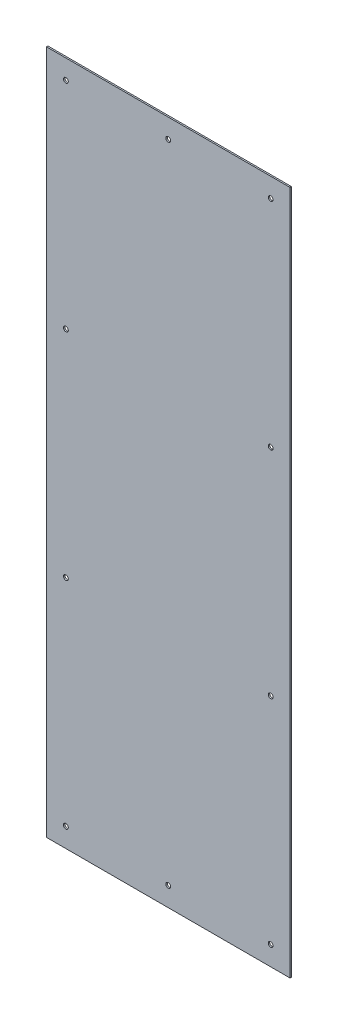
ISO-10303-21;
HEADER;
FILE_DESCRIPTION(('STEP AP214'),'2;1');
FILE_NAME('part.step','',(''),(''),'','','');
FILE_SCHEMA(('AUTOMOTIVE_DESIGN { 1 0 10303 214 1 1 1 1 }'));
ENDSEC;
DATA;
#1=APPLICATION_CONTEXT('core data for automotive mechanical design processes');
#2=APPLICATION_PROTOCOL_DEFINITION('international standard','automotive_design',2000,#1);
#3=PRODUCT_CONTEXT('',#1,'mechanical');
#4=PRODUCT('Part','Part','',(#3));
#5=PRODUCT_RELATED_PRODUCT_CATEGORY('part','',(#4));
#6=PRODUCT_DEFINITION_FORMATION('','',#4);
#7=PRODUCT_DEFINITION_CONTEXT('part definition',#1,'design');
#8=PRODUCT_DEFINITION('design','',#6,#7);
#9=PRODUCT_DEFINITION_SHAPE('','',#8);
#10=(LENGTH_UNIT() NAMED_UNIT(*) SI_UNIT(.MILLI.,.METRE.));
#11=(NAMED_UNIT(*) PLANE_ANGLE_UNIT() SI_UNIT($,.RADIAN.));
#12=(NAMED_UNIT(*) SI_UNIT($,.STERADIAN.) SOLID_ANGLE_UNIT());
#13=UNCERTAINTY_MEASURE_WITH_UNIT(LENGTH_MEASURE(1.E-05),#10,'distance_accuracy_value','');
#14=(GEOMETRIC_REPRESENTATION_CONTEXT(3) GLOBAL_UNCERTAINTY_ASSIGNED_CONTEXT((#13)) GLOBAL_UNIT_ASSIGNED_CONTEXT((#10,
#11,#12)) REPRESENTATION_CONTEXT('',''));
#15=CARTESIAN_POINT('',(0.,0.,0.));
#16=DIRECTION('',(0.,0.,1.));
#17=DIRECTION('',(1.,0.,0.));
#18=AXIS2_PLACEMENT_3D('',#15,#16,#17);
#19=CARTESIAN_POINT('',(160.,450.,1.9));
#20=DIRECTION('',(-1.,0.,0.));
#21=DIRECTION('',(0.,-1.,0.));
#22=AXIS2_PLACEMENT_3D('',#19,#20,#21);
#23=PLANE('',#22);
#24=DIRECTION('',(0.,1.,0.));
#25=VECTOR('',#24,1.);
#26=CARTESIAN_POINT('',(160.,450.,0.));
#27=LINE('',#26,#25);
#28=CARTESIAN_POINT('',(160.,-450.,0.));
#29=VERTEX_POINT('',#28);
#30=CARTESIAN_POINT('',(160.,450.,0.));
#31=VERTEX_POINT('',#30);
#32=EDGE_CURVE('E98',#29,#31,#27,.T.);
#33=ORIENTED_EDGE('',*,*,#32,.T.);
#34=DIRECTION('',(0.,0.,-1.));
#35=VECTOR('',#34,1.);
#36=CARTESIAN_POINT('',(160.,450.,1.9));
#37=LINE('',#36,#35);
#38=CARTESIAN_POINT('',(160.,450.,1.9));
#39=VERTEX_POINT('',#38);
#40=EDGE_CURVE('E11',#39,#31,#37,.T.);
#41=ORIENTED_EDGE('',*,*,#40,.F.);
#42=DIRECTION('',(0.,1.,0.));
#43=VECTOR('',#42,1.);
#44=CARTESIAN_POINT('',(160.,450.,1.9));
#45=LINE('',#44,#43);
#46=CARTESIAN_POINT('',(160.,-450.,1.9));
#47=VERTEX_POINT('',#46);
#48=EDGE_CURVE('E85',#47,#39,#45,.T.);
#49=ORIENTED_EDGE('',*,*,#48,.F.);
#50=DIRECTION('',(0.,0.,-1.));
#51=VECTOR('',#50,1.);
#52=CARTESIAN_POINT('',(160.,-450.,1.9));
#53=LINE('',#52,#51);
#54=EDGE_CURVE('E94',#47,#29,#53,.T.);
#55=ORIENTED_EDGE('',*,*,#54,.T.);
#56=EDGE_LOOP('',(#33,#41,#49,#55));
#57=FACE_BOUND('',#56,.T.);
#58=ADVANCED_FACE('F32',(#57),#23,.F.);
#59=CARTESIAN_POINT('',(-160.,450.,1.9));
#60=DIRECTION('',(0.,-1.,0.));
#61=DIRECTION('',(0.,0.,-1.));
#62=AXIS2_PLACEMENT_3D('',#59,#60,#61);
#63=PLANE('',#62);
#64=DIRECTION('',(-1.,0.,0.));
#65=VECTOR('',#64,1.);
#66=CARTESIAN_POINT('',(-160.,450.,0.));
#67=LINE('',#66,#65);
#68=CARTESIAN_POINT('',(-160.,450.,0.));
#69=VERTEX_POINT('',#68);
#70=EDGE_CURVE('E89',#31,#69,#67,.T.);
#71=ORIENTED_EDGE('',*,*,#70,.T.);
#72=DIRECTION('',(0.,0.,-1.));
#73=VECTOR('',#72,1.);
#74=CARTESIAN_POINT('',(-160.,450.,1.9));
#75=LINE('',#74,#73);
#76=CARTESIAN_POINT('',(-160.,450.,1.9));
#77=VERTEX_POINT('',#76);
#78=EDGE_CURVE('E41',#77,#69,#75,.T.);
#79=ORIENTED_EDGE('',*,*,#78,.F.);
#80=DIRECTION('',(-1.,0.,0.));
#81=VECTOR('',#80,1.);
#82=CARTESIAN_POINT('',(-160.,450.,1.9));
#83=LINE('',#82,#81);
#84=EDGE_CURVE('E80',#39,#77,#83,.T.);
#85=ORIENTED_EDGE('',*,*,#84,.F.);
#86=ORIENTED_EDGE('',*,*,#40,.T.);
#87=EDGE_LOOP('',(#71,#79,#85,#86));
#88=FACE_BOUND('',#87,.T.);
#89=ADVANCED_FACE('F88',(#88),#63,.F.);
#90=CARTESIAN_POINT('',(-160.,450.,1.9));
#91=DIRECTION('',(1.,0.,0.));
#92=DIRECTION('',(0.,1.,0.));
#93=AXIS2_PLACEMENT_3D('',#90,#91,#92);
#94=PLANE('',#93);
#95=DIRECTION('',(0.,-1.,0.));
#96=VECTOR('',#95,1.);
#97=CARTESIAN_POINT('',(-160.,450.,0.));
#98=LINE('',#97,#96);
#99=CARTESIAN_POINT('',(-160.,-450.,0.));
#100=VERTEX_POINT('',#99);
#101=EDGE_CURVE('E67',#69,#100,#98,.T.);
#102=ORIENTED_EDGE('',*,*,#101,.T.);
#103=DIRECTION('',(0.,0.,-1.));
#104=VECTOR('',#103,1.);
#105=CARTESIAN_POINT('',(-160.,-450.,1.9));
#106=LINE('',#105,#104);
#107=CARTESIAN_POINT('',(-160.,-450.,1.9));
#108=VERTEX_POINT('',#107);
#109=EDGE_CURVE('E90',#108,#100,#106,.T.);
#110=ORIENTED_EDGE('',*,*,#109,.F.);
#111=DIRECTION('',(0.,-1.,0.));
#112=VECTOR('',#111,1.);
#113=CARTESIAN_POINT('',(-160.,450.,1.9));
#114=LINE('',#113,#112);
#115=EDGE_CURVE('E83',#77,#108,#114,.T.);
#116=ORIENTED_EDGE('',*,*,#115,.F.);
#117=ORIENTED_EDGE('',*,*,#78,.T.);
#118=EDGE_LOOP('',(#102,#110,#116,#117));
#119=FACE_BOUND('',#118,.T.);
#120=ADVANCED_FACE('F92',(#119),#94,.F.);
#121=CARTESIAN_POINT('',(-160.,-450.,1.9));
#122=DIRECTION('',(0.,1.,0.));
#123=DIRECTION('',(0.,0.,1.));
#124=AXIS2_PLACEMENT_3D('',#121,#122,#123);
#125=PLANE('',#124);
#126=DIRECTION('',(1.,0.,0.));
#127=VECTOR('',#126,1.);
#128=CARTESIAN_POINT('',(-160.,-450.,0.));
#129=LINE('',#128,#127);
#130=EDGE_CURVE('E73',#100,#29,#129,.T.);
#131=ORIENTED_EDGE('',*,*,#130,.T.);
#132=ORIENTED_EDGE('',*,*,#54,.F.);
#133=DIRECTION('',(1.,0.,0.));
#134=VECTOR('',#133,1.);
#135=CARTESIAN_POINT('',(-160.,-450.,1.9));
#136=LINE('',#135,#134);
#137=EDGE_CURVE('E50',#108,#47,#136,.T.);
#138=ORIENTED_EDGE('',*,*,#137,.F.);
#139=ORIENTED_EDGE('',*,*,#109,.T.);
#140=EDGE_LOOP('',(#131,#132,#138,#139));
#141=FACE_BOUND('',#140,.T.);
#142=ADVANCED_FACE('F176',(#141),#125,.F.);
#143=CARTESIAN_POINT('',(0.,0.,1.9));
#144=DIRECTION('',(0.,0.,1.));
#145=DIRECTION('',(1.,0.,0.));
#146=AXIS2_PLACEMENT_3D('',#143,#144,#145);
#147=PLANE('',#146);
#148=CARTESIAN_POINT('',(-134.6,-141.52,1.9));
#149=DIRECTION('',(0.,0.,1.));
#150=DIRECTION('',(1.,0.,0.));
#151=AXIS2_PLACEMENT_3D('',#148,#149,#150);
#152=CIRCLE('',#151,3.175);
#153=CARTESIAN_POINT('',(-131.425,-141.52,1.9));
#154=VERTEX_POINT('',#153);
#155=EDGE_CURVE('E147',#154,#154,#152,.T.);
#156=ORIENTED_EDGE('',*,*,#155,.F.);
#157=EDGE_LOOP('',(#156));
#158=FACE_BOUND('',#157,.T.);
#159=CARTESIAN_POINT('',(134.6,141.54,1.9));
#160=DIRECTION('',(0.,0.,1.));
#161=DIRECTION('',(-1.,0.,0.));
#162=AXIS2_PLACEMENT_3D('',#159,#160,#161);
#163=CIRCLE('',#162,3.175);
#164=CARTESIAN_POINT('',(131.425,141.54,1.9));
#165=VERTEX_POINT('',#164);
#166=EDGE_CURVE('E155',#165,#165,#163,.T.);
#167=ORIENTED_EDGE('',*,*,#166,.F.);
#168=EDGE_LOOP('',(#167));
#169=FACE_BOUND('',#168,.T.);
#170=CARTESIAN_POINT('',(134.6,-141.52,1.9));
#171=DIRECTION('',(0.,0.,1.));
#172=DIRECTION('',(-1.,0.,0.));
#173=AXIS2_PLACEMENT_3D('',#170,#171,#172);
#174=CIRCLE('',#173,3.175);
#175=CARTESIAN_POINT('',(131.425,-141.52,1.9));
#176=VERTEX_POINT('',#175);
#177=EDGE_CURVE('E158',#176,#176,#174,.T.);
#178=ORIENTED_EDGE('',*,*,#177,.F.);
#179=EDGE_LOOP('',(#178));
#180=FACE_BOUND('',#179,.T.);
#181=CARTESIAN_POINT('',(0.,424.6,1.9));
#182=DIRECTION('',(0.,0.,1.));
#183=DIRECTION('',(1.,0.,0.));
#184=AXIS2_PLACEMENT_3D('',#181,#182,#183);
#185=CIRCLE('',#184,3.175);
#186=CARTESIAN_POINT('',(3.175,424.6,1.9));
#187=VERTEX_POINT('',#186);
#188=EDGE_CURVE('E164',#187,#187,#185,.T.);
#189=ORIENTED_EDGE('',*,*,#188,.F.);
#190=EDGE_LOOP('',(#189));
#191=FACE_BOUND('',#190,.T.);
#192=CARTESIAN_POINT('',(1.66533453693773E-13,-424.6,1.9));
#193=DIRECTION('',(0.,0.,1.));
#194=DIRECTION('',(1.,0.,0.));
#195=AXIS2_PLACEMENT_3D('',#192,#193,#194);
#196=CIRCLE('',#195,3.175);
#197=CARTESIAN_POINT('',(3.17500000000017,-424.6,1.9));
#198=VERTEX_POINT('',#197);
#199=EDGE_CURVE('E161',#198,#198,#196,.T.);
#200=ORIENTED_EDGE('',*,*,#199,.F.);
#201=EDGE_LOOP('',(#200));
#202=FACE_BOUND('',#201,.T.);
#203=CARTESIAN_POINT('',(-134.6,141.54,1.9));
#204=DIRECTION('',(0.,0.,1.));
#205=DIRECTION('',(1.,0.,0.));
#206=AXIS2_PLACEMENT_3D('',#203,#204,#205);
#207=CIRCLE('',#206,3.175);
#208=CARTESIAN_POINT('',(-131.425,141.54,1.9));
#209=VERTEX_POINT('',#208);
#210=EDGE_CURVE('E143',#209,#209,#207,.T.);
#211=ORIENTED_EDGE('',*,*,#210,.F.);
#212=EDGE_LOOP('',(#211));
#213=FACE_BOUND('',#212,.T.);
#214=CARTESIAN_POINT('',(-134.6,-424.6,1.9));
#215=DIRECTION('',(0.,0.,1.));
#216=DIRECTION('',(-1.,0.,0.));
#217=AXIS2_PLACEMENT_3D('',#214,#215,#216);
#218=CIRCLE('',#217,3.17500000000016);
#219=CARTESIAN_POINT('',(-137.775,-424.6,1.9));
#220=VERTEX_POINT('',#219);
#221=EDGE_CURVE('E146',#220,#220,#218,.T.);
#222=ORIENTED_EDGE('',*,*,#221,.F.);
#223=EDGE_LOOP('',(#222));
#224=FACE_BOUND('',#223,.T.);
#225=CARTESIAN_POINT('',(134.600000000001,-424.6,1.9));
#226=DIRECTION('',(0.,0.,1.));
#227=DIRECTION('',(1.,0.,0.));
#228=AXIS2_PLACEMENT_3D('',#225,#226,#227);
#229=CIRCLE('',#228,3.17500000000002);
#230=CARTESIAN_POINT('',(137.775000000001,-424.6,1.9));
#231=VERTEX_POINT('',#230);
#232=EDGE_CURVE('E150',#231,#231,#229,.T.);
#233=ORIENTED_EDGE('',*,*,#232,.F.);
#234=EDGE_LOOP('',(#233));
#235=FACE_BOUND('',#234,.T.);
#236=CARTESIAN_POINT('',(134.6,424.6,1.9));
#237=DIRECTION('',(0.,0.,1.));
#238=DIRECTION('',(-1.,0.,0.));
#239=AXIS2_PLACEMENT_3D('',#236,#237,#238);
#240=CIRCLE('',#239,3.17499999999992);
#241=CARTESIAN_POINT('',(131.425,424.6,1.9));
#242=VERTEX_POINT('',#241);
#243=EDGE_CURVE('E114',#242,#242,#240,.T.);
#244=ORIENTED_EDGE('',*,*,#243,.F.);
#245=EDGE_LOOP('',(#244));
#246=FACE_BOUND('',#245,.T.);
#247=CARTESIAN_POINT('',(-134.6,424.6,1.9));
#248=DIRECTION('',(0.,0.,1.));
#249=DIRECTION('',(1.,0.,0.));
#250=AXIS2_PLACEMENT_3D('',#247,#248,#249);
#251=CIRCLE('',#250,3.175);
#252=CARTESIAN_POINT('',(-131.425,424.6,1.9));
#253=VERTEX_POINT('',#252);
#254=EDGE_CURVE('E109',#253,#253,#251,.T.);
#255=ORIENTED_EDGE('',*,*,#254,.F.);
#256=EDGE_LOOP('',(#255));
#257=FACE_BOUND('',#256,.T.);
#258=ORIENTED_EDGE('',*,*,#48,.T.);
#259=ORIENTED_EDGE('',*,*,#84,.T.);
#260=ORIENTED_EDGE('',*,*,#115,.T.);
#261=ORIENTED_EDGE('',*,*,#137,.T.);
#262=EDGE_LOOP('',(#258,#259,#260,#261));
#263=FACE_BOUND('',#262,.T.);
#264=ADVANCED_FACE('F81',(#158,#169,#180,#191,#202,#213,#224,#235,#246,#257,#263),#147,.T.);
#265=CARTESIAN_POINT('',(0.,0.,0.));
#266=DIRECTION('',(0.,0.,1.));
#267=DIRECTION('',(1.,0.,0.));
#268=AXIS2_PLACEMENT_3D('',#265,#266,#267);
#269=PLANE('',#268);
#270=CARTESIAN_POINT('',(-134.6,-141.52,0.));
#271=DIRECTION('',(0.,0.,1.));
#272=DIRECTION('',(1.,0.,0.));
#273=AXIS2_PLACEMENT_3D('',#270,#271,#272);
#274=CIRCLE('',#273,3.175);
#275=CARTESIAN_POINT('',(-131.425,-141.52,0.));
#276=VERTEX_POINT('',#275);
#277=EDGE_CURVE('E35',#276,#276,#274,.T.);
#278=ORIENTED_EDGE('',*,*,#277,.T.);
#279=EDGE_LOOP('',(#278));
#280=FACE_BOUND('',#279,.T.);
#281=CARTESIAN_POINT('',(134.6,141.54,0.));
#282=DIRECTION('',(0.,0.,1.));
#283=DIRECTION('',(1.,0.,0.));
#284=AXIS2_PLACEMENT_3D('',#281,#282,#283);
#285=CIRCLE('',#284,3.175);
#286=CARTESIAN_POINT('',(137.775,141.54,0.));
#287=VERTEX_POINT('',#286);
#288=EDGE_CURVE('E131',#287,#287,#285,.T.);
#289=ORIENTED_EDGE('',*,*,#288,.T.);
#290=EDGE_LOOP('',(#289));
#291=FACE_BOUND('',#290,.T.);
#292=CARTESIAN_POINT('',(134.6,-141.52,0.));
#293=DIRECTION('',(0.,0.,1.));
#294=DIRECTION('',(1.,0.,0.));
#295=AXIS2_PLACEMENT_3D('',#292,#293,#294);
#296=CIRCLE('',#295,3.175);
#297=CARTESIAN_POINT('',(137.775,-141.52,0.));
#298=VERTEX_POINT('',#297);
#299=EDGE_CURVE('E129',#298,#298,#296,.T.);
#300=ORIENTED_EDGE('',*,*,#299,.T.);
#301=EDGE_LOOP('',(#300));
#302=FACE_BOUND('',#301,.T.);
#303=CARTESIAN_POINT('',(0.,424.6,0.));
#304=DIRECTION('',(0.,0.,1.));
#305=DIRECTION('',(1.,0.,0.));
#306=AXIS2_PLACEMENT_3D('',#303,#304,#305);
#307=CIRCLE('',#306,3.175);
#308=CARTESIAN_POINT('',(3.175,424.6,0.));
#309=VERTEX_POINT('',#308);
#310=EDGE_CURVE('E126',#309,#309,#307,.T.);
#311=ORIENTED_EDGE('',*,*,#310,.T.);
#312=EDGE_LOOP('',(#311));
#313=FACE_BOUND('',#312,.T.);
#314=CARTESIAN_POINT('',(1.66533453693773E-13,-424.6,0.));
#315=DIRECTION('',(0.,0.,1.));
#316=DIRECTION('',(1.,0.,0.));
#317=AXIS2_PLACEMENT_3D('',#314,#315,#316);
#318=CIRCLE('',#317,3.175);
#319=CARTESIAN_POINT('',(3.17500000000017,-424.6,0.));
#320=VERTEX_POINT('',#319);
#321=EDGE_CURVE('E123',#320,#320,#318,.T.);
#322=ORIENTED_EDGE('',*,*,#321,.T.);
#323=EDGE_LOOP('',(#322));
#324=FACE_BOUND('',#323,.T.);
#325=CARTESIAN_POINT('',(-134.6,141.54,0.));
#326=DIRECTION('',(0.,0.,1.));
#327=DIRECTION('',(1.,0.,0.));
#328=AXIS2_PLACEMENT_3D('',#325,#326,#327);
#329=CIRCLE('',#328,3.175);
#330=CARTESIAN_POINT('',(-131.425,141.54,0.));
#331=VERTEX_POINT('',#330);
#332=EDGE_CURVE('E120',#331,#331,#329,.T.);
#333=ORIENTED_EDGE('',*,*,#332,.T.);
#334=EDGE_LOOP('',(#333));
#335=FACE_BOUND('',#334,.T.);
#336=CARTESIAN_POINT('',(-134.6,-424.6,0.));
#337=DIRECTION('',(0.,0.,1.));
#338=DIRECTION('',(1.,0.,0.));
#339=AXIS2_PLACEMENT_3D('',#336,#337,#338);
#340=CIRCLE('',#339,3.17500000000016);
#341=CARTESIAN_POINT('',(-131.425,-424.6,0.));
#342=VERTEX_POINT('',#341);
#343=EDGE_CURVE('E117',#342,#342,#340,.T.);
#344=ORIENTED_EDGE('',*,*,#343,.T.);
#345=EDGE_LOOP('',(#344));
#346=FACE_BOUND('',#345,.T.);
#347=CARTESIAN_POINT('',(134.600000000001,-424.6,0.));
#348=DIRECTION('',(0.,0.,1.));
#349=DIRECTION('',(1.,0.,0.));
#350=AXIS2_PLACEMENT_3D('',#347,#348,#349);
#351=CIRCLE('',#350,3.17500000000002);
#352=CARTESIAN_POINT('',(137.775000000001,-424.6,0.));
#353=VERTEX_POINT('',#352);
#354=EDGE_CURVE('E113',#353,#353,#351,.T.);
#355=ORIENTED_EDGE('',*,*,#354,.T.);
#356=EDGE_LOOP('',(#355));
#357=FACE_BOUND('',#356,.T.);
#358=CARTESIAN_POINT('',(134.6,424.6,0.));
#359=DIRECTION('',(0.,0.,1.));
#360=DIRECTION('',(1.,0.,0.));
#361=AXIS2_PLACEMENT_3D('',#358,#359,#360);
#362=CIRCLE('',#361,3.17499999999992);
#363=CARTESIAN_POINT('',(137.775,424.6,0.));
#364=VERTEX_POINT('',#363);
#365=EDGE_CURVE('E110',#364,#364,#362,.T.);
#366=ORIENTED_EDGE('',*,*,#365,.T.);
#367=EDGE_LOOP('',(#366));
#368=FACE_BOUND('',#367,.T.);
#369=CARTESIAN_POINT('',(-134.6,424.6,0.));
#370=DIRECTION('',(0.,0.,1.));
#371=DIRECTION('',(1.,0.,0.));
#372=AXIS2_PLACEMENT_3D('',#369,#370,#371);
#373=CIRCLE('',#372,3.175);
#374=CARTESIAN_POINT('',(-131.425,424.6,0.));
#375=VERTEX_POINT('',#374);
#376=EDGE_CURVE('E101',#375,#375,#373,.T.);
#377=ORIENTED_EDGE('',*,*,#376,.T.);
#378=EDGE_LOOP('',(#377));
#379=FACE_BOUND('',#378,.T.);
#380=ORIENTED_EDGE('',*,*,#32,.F.);
#381=ORIENTED_EDGE('',*,*,#130,.F.);
#382=ORIENTED_EDGE('',*,*,#101,.F.);
#383=ORIENTED_EDGE('',*,*,#70,.F.);
#384=EDGE_LOOP('',(#380,#381,#382,#383));
#385=FACE_BOUND('',#384,.T.);
#386=ADVANCED_FACE('F175',(#280,#291,#302,#313,#324,#335,#346,#357,#368,#379,#385),#269,.F.);
#387=CARTESIAN_POINT('',(-134.6,424.6,-8.1));
#388=DIRECTION('',(0.,0.,1.));
#389=DIRECTION('',(1.,0.,0.));
#390=AXIS2_PLACEMENT_3D('',#387,#388,#389);
#391=CYLINDRICAL_SURFACE('',#390,3.175);
#392=ORIENTED_EDGE('',*,*,#254,.T.);
#393=EDGE_LOOP('',(#392));
#394=FACE_BOUND('',#393,.T.);
#395=ORIENTED_EDGE('',*,*,#376,.F.);
#396=EDGE_LOOP('',(#395));
#397=FACE_BOUND('',#396,.T.);
#398=ADVANCED_FACE('F196',(#394,#397),#391,.F.);
#399=CARTESIAN_POINT('',(134.6,424.6,-8.1));
#400=DIRECTION('',(0.,0.,1.));
#401=DIRECTION('',(1.,0.,0.));
#402=AXIS2_PLACEMENT_3D('',#399,#400,#401);
#403=CYLINDRICAL_SURFACE('',#402,3.17499999999992);
#404=ORIENTED_EDGE('',*,*,#243,.T.);
#405=EDGE_LOOP('',(#404));
#406=FACE_BOUND('',#405,.T.);
#407=ORIENTED_EDGE('',*,*,#365,.F.);
#408=EDGE_LOOP('',(#407));
#409=FACE_BOUND('',#408,.T.);
#410=ADVANCED_FACE('F192',(#406,#409),#403,.F.);
#411=CARTESIAN_POINT('',(134.600000000001,-424.6,-8.1));
#412=DIRECTION('',(0.,0.,1.));
#413=DIRECTION('',(1.,0.,0.));
#414=AXIS2_PLACEMENT_3D('',#411,#412,#413);
#415=CYLINDRICAL_SURFACE('',#414,3.17500000000002);
#416=ORIENTED_EDGE('',*,*,#232,.T.);
#417=EDGE_LOOP('',(#416));
#418=FACE_BOUND('',#417,.T.);
#419=ORIENTED_EDGE('',*,*,#354,.F.);
#420=EDGE_LOOP('',(#419));
#421=FACE_BOUND('',#420,.T.);
#422=ADVANCED_FACE('F195',(#418,#421),#415,.F.);
#423=CARTESIAN_POINT('',(-134.6,-424.6,-8.1));
#424=DIRECTION('',(0.,0.,1.));
#425=DIRECTION('',(1.,0.,0.));
#426=AXIS2_PLACEMENT_3D('',#423,#424,#425);
#427=CYLINDRICAL_SURFACE('',#426,3.17500000000016);
#428=ORIENTED_EDGE('',*,*,#221,.T.);
#429=EDGE_LOOP('',(#428));
#430=FACE_BOUND('',#429,.T.);
#431=ORIENTED_EDGE('',*,*,#343,.F.);
#432=EDGE_LOOP('',(#431));
#433=FACE_BOUND('',#432,.T.);
#434=ADVANCED_FACE('F262',(#430,#433),#427,.F.);
#435=CARTESIAN_POINT('',(-134.6,141.54,-8.1));
#436=DIRECTION('',(0.,0.,1.));
#437=DIRECTION('',(1.,0.,0.));
#438=AXIS2_PLACEMENT_3D('',#435,#436,#437);
#439=CYLINDRICAL_SURFACE('',#438,3.175);
#440=ORIENTED_EDGE('',*,*,#210,.T.);
#441=EDGE_LOOP('',(#440));
#442=FACE_BOUND('',#441,.T.);
#443=ORIENTED_EDGE('',*,*,#332,.F.);
#444=EDGE_LOOP('',(#443));
#445=FACE_BOUND('',#444,.T.);
#446=ADVANCED_FACE('F272',(#442,#445),#439,.F.);
#447=CARTESIAN_POINT('',(1.66533453693773E-13,-424.6,-8.1));
#448=DIRECTION('',(0.,0.,1.));
#449=DIRECTION('',(1.,0.,0.));
#450=AXIS2_PLACEMENT_3D('',#447,#448,#449);
#451=CYLINDRICAL_SURFACE('',#450,3.175);
#452=ORIENTED_EDGE('',*,*,#199,.T.);
#453=EDGE_LOOP('',(#452));
#454=FACE_BOUND('',#453,.T.);
#455=ORIENTED_EDGE('',*,*,#321,.F.);
#456=EDGE_LOOP('',(#455));
#457=FACE_BOUND('',#456,.T.);
#458=ADVANCED_FACE('F282',(#454,#457),#451,.F.);
#459=CARTESIAN_POINT('',(0.,424.6,-8.1));
#460=DIRECTION('',(0.,0.,1.));
#461=DIRECTION('',(1.,0.,0.));
#462=AXIS2_PLACEMENT_3D('',#459,#460,#461);
#463=CYLINDRICAL_SURFACE('',#462,3.175);
#464=ORIENTED_EDGE('',*,*,#188,.T.);
#465=EDGE_LOOP('',(#464));
#466=FACE_BOUND('',#465,.T.);
#467=ORIENTED_EDGE('',*,*,#310,.F.);
#468=EDGE_LOOP('',(#467));
#469=FACE_BOUND('',#468,.T.);
#470=ADVANCED_FACE('F292',(#466,#469),#463,.F.);
#471=CARTESIAN_POINT('',(134.6,-141.52,-8.1));
#472=DIRECTION('',(0.,0.,1.));
#473=DIRECTION('',(1.,0.,0.));
#474=AXIS2_PLACEMENT_3D('',#471,#472,#473);
#475=CYLINDRICAL_SURFACE('',#474,3.175);
#476=ORIENTED_EDGE('',*,*,#177,.T.);
#477=EDGE_LOOP('',(#476));
#478=FACE_BOUND('',#477,.T.);
#479=ORIENTED_EDGE('',*,*,#299,.F.);
#480=EDGE_LOOP('',(#479));
#481=FACE_BOUND('',#480,.T.);
#482=ADVANCED_FACE('F170',(#478,#481),#475,.F.);
#483=CARTESIAN_POINT('',(134.6,141.54,-8.1));
#484=DIRECTION('',(0.,0.,1.));
#485=DIRECTION('',(1.,0.,0.));
#486=AXIS2_PLACEMENT_3D('',#483,#484,#485);
#487=CYLINDRICAL_SURFACE('',#486,3.175);
#488=ORIENTED_EDGE('',*,*,#166,.T.);
#489=EDGE_LOOP('',(#488));
#490=FACE_BOUND('',#489,.T.);
#491=ORIENTED_EDGE('',*,*,#288,.F.);
#492=EDGE_LOOP('',(#491));
#493=FACE_BOUND('',#492,.T.);
#494=ADVANCED_FACE('F311',(#490,#493),#487,.F.);
#495=CARTESIAN_POINT('',(-134.6,-141.52,-8.1));
#496=DIRECTION('',(0.,0.,1.));
#497=DIRECTION('',(1.,0.,0.));
#498=AXIS2_PLACEMENT_3D('',#495,#496,#497);
#499=CYLINDRICAL_SURFACE('',#498,3.175);
#500=ORIENTED_EDGE('',*,*,#155,.T.);
#501=EDGE_LOOP('',(#500));
#502=FACE_BOUND('',#501,.T.);
#503=ORIENTED_EDGE('',*,*,#277,.F.);
#504=EDGE_LOOP('',(#503));
#505=FACE_BOUND('',#504,.T.);
#506=ADVANCED_FACE('F320',(#502,#505),#499,.F.);
#507=CLOSED_SHELL('',(#58,#89,#120,#142,#264,#386,#398,#410,#422,#434,#446,#458,#470,#482,#494,#506));
#508=MANIFOLD_SOLID_BREP('B2',#507);
#509=ADVANCED_BREP_SHAPE_REPRESENTATION('',(#18,#508),#14);
#510=SHAPE_DEFINITION_REPRESENTATION(#9,#509);
ENDSEC;
END-ISO-10303-21;
